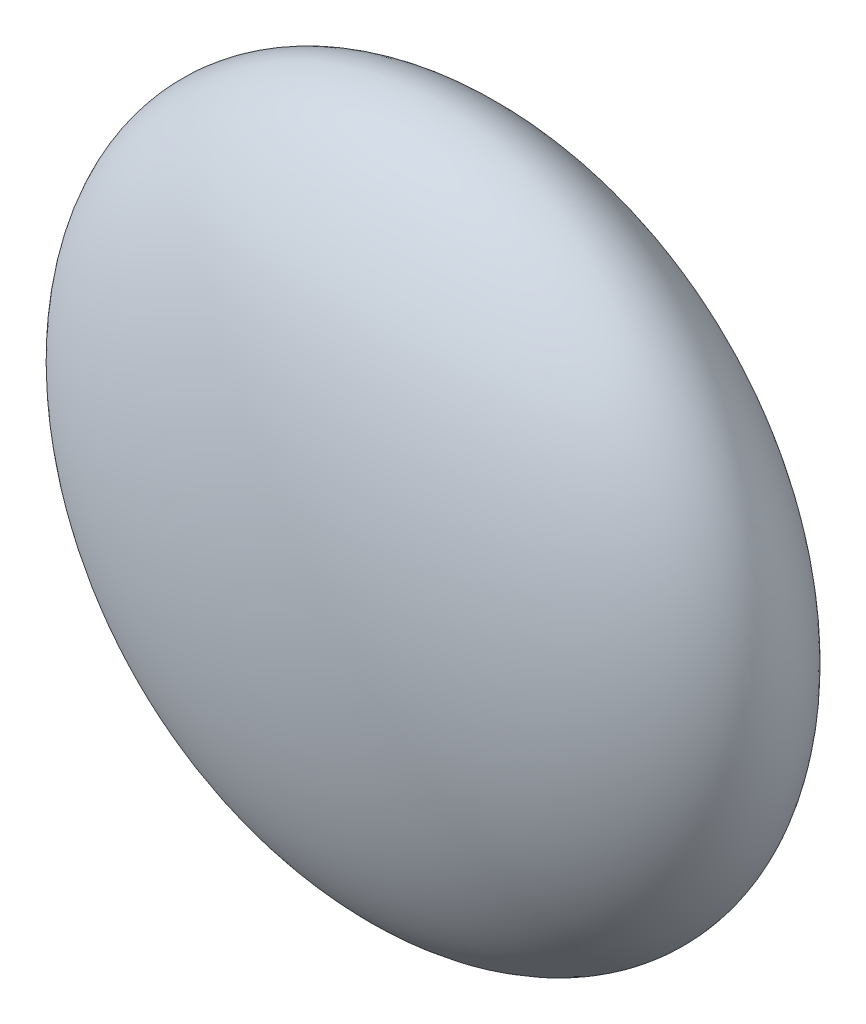
ISO-10303-21;
HEADER;
FILE_DESCRIPTION(('STEP AP214'),'2;1');
FILE_NAME('part.step','',(''),(''),'','','');
FILE_SCHEMA(('AUTOMOTIVE_DESIGN { 1 0 10303 214 1 1 1 1 }'));
ENDSEC;
DATA;
#1=APPLICATION_CONTEXT('core data for automotive mechanical design processes');
#2=APPLICATION_PROTOCOL_DEFINITION('international standard','automotive_design',2000,#1);
#3=PRODUCT_CONTEXT('',#1,'mechanical');
#4=PRODUCT('Part','Part','',(#3));
#5=PRODUCT_RELATED_PRODUCT_CATEGORY('part','',(#4));
#6=PRODUCT_DEFINITION_FORMATION('','',#4);
#7=PRODUCT_DEFINITION_CONTEXT('part definition',#1,'design');
#8=PRODUCT_DEFINITION('design','',#6,#7);
#9=PRODUCT_DEFINITION_SHAPE('','',#8);
#10=(LENGTH_UNIT() NAMED_UNIT(*) SI_UNIT(.MILLI.,.METRE.));
#11=(NAMED_UNIT(*) PLANE_ANGLE_UNIT() SI_UNIT($,.RADIAN.));
#12=(NAMED_UNIT(*) SI_UNIT($,.STERADIAN.) SOLID_ANGLE_UNIT());
#13=UNCERTAINTY_MEASURE_WITH_UNIT(LENGTH_MEASURE(1.E-05),#10,'distance_accuracy_value','');
#14=(GEOMETRIC_REPRESENTATION_CONTEXT(3) GLOBAL_UNCERTAINTY_ASSIGNED_CONTEXT((#13)) GLOBAL_UNIT_ASSIGNED_CONTEXT((#10,
#11,#12)) REPRESENTATION_CONTEXT('',''));
#15=CARTESIAN_POINT('',(0.,0.,0.));
#16=DIRECTION('',(0.,0.,1.));
#17=DIRECTION('',(1.,0.,0.));
#18=AXIS2_PLACEMENT_3D('',#15,#16,#17);
#19=CARTESIAN_POINT('',(0.,0.,0.));
#20=DIRECTION('',(1.,0.,0.));
#21=DIRECTION('',(0.,1.,0.));
#22=AXIS2_PLACEMENT_3D('',#19,#20,#21);
#23=ELLIPSE('',#22,0.55,0.242);
#24=TRIMMED_CURVE('',#23,(PARAMETER_VALUE(4.71238898038469)),
(PARAMETER_VALUE(7.85398163397448)),.T.,.PARAMETER.);
#25=CARTESIAN_POINT('',(0.,0.,0.242));
#26=DIRECTION('',(0.,0.,1.));
#27=AXIS1_PLACEMENT('',#25,#26);
#28=SURFACE_OF_REVOLUTION('',#24,#27);
#29=CARTESIAN_POINT('',(0.,0.,0.242));
#30=VERTEX_POINT('',#29);
#31=VERTEX_LOOP('',#30);
#32=FACE_BOUND('',#31,.T.);
#33=CARTESIAN_POINT('',(0.,0.,-0.242));
#34=VERTEX_POINT('',#33);
#35=VERTEX_LOOP('',#34);
#36=FACE_BOUND('',#35,.T.);
#37=ADVANCED_FACE('F38',(#32,#36),#28,.T.);
#38=CLOSED_SHELL('',(#37));
#39=MANIFOLD_SOLID_BREP('B2',#38);
#40=ADVANCED_BREP_SHAPE_REPRESENTATION('',(#18,#39),#14);
#41=SHAPE_DEFINITION_REPRESENTATION(#9,#40);
ENDSEC;
END-ISO-10303-21;
